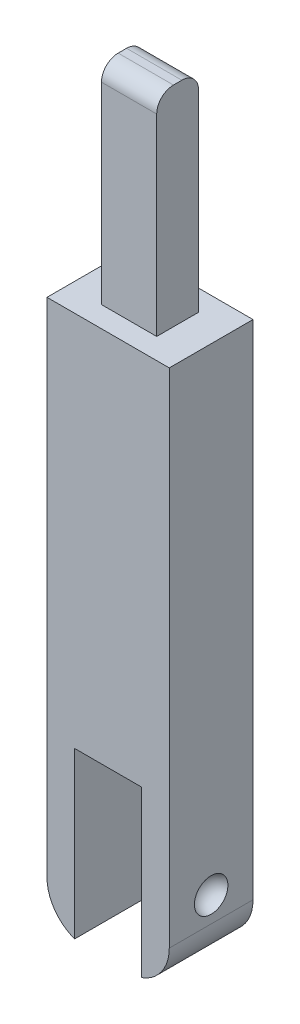
ISO-10303-21;
HEADER;
FILE_DESCRIPTION(('STEP AP214'),'2;1');
FILE_NAME('part.step','',(''),(''),'','','');
FILE_SCHEMA(('AUTOMOTIVE_DESIGN { 1 0 10303 214 1 1 1 1 }'));
ENDSEC;
DATA;
#1=APPLICATION_CONTEXT('core data for automotive mechanical design processes');
#2=APPLICATION_PROTOCOL_DEFINITION('international standard','automotive_design',2000,#1);
#3=PRODUCT_CONTEXT('',#1,'mechanical');
#4=PRODUCT('Part','Part','',(#3));
#5=PRODUCT_RELATED_PRODUCT_CATEGORY('part','',(#4));
#6=PRODUCT_DEFINITION_FORMATION('','',#4);
#7=PRODUCT_DEFINITION_CONTEXT('part definition',#1,'design');
#8=PRODUCT_DEFINITION('design','',#6,#7);
#9=PRODUCT_DEFINITION_SHAPE('','',#8);
#10=(LENGTH_UNIT() NAMED_UNIT(*) SI_UNIT(.MILLI.,.METRE.));
#11=(NAMED_UNIT(*) PLANE_ANGLE_UNIT() SI_UNIT($,.RADIAN.));
#12=(NAMED_UNIT(*) SI_UNIT($,.STERADIAN.) SOLID_ANGLE_UNIT());
#13=UNCERTAINTY_MEASURE_WITH_UNIT(LENGTH_MEASURE(1.E-05),#10,'distance_accuracy_value','');
#14=(GEOMETRIC_REPRESENTATION_CONTEXT(3) GLOBAL_UNCERTAINTY_ASSIGNED_CONTEXT((#13)) GLOBAL_UNIT_ASSIGNED_CONTEXT((#10,
#11,#12)) REPRESENTATION_CONTEXT('',''));
#15=CARTESIAN_POINT('',(0.,0.,0.));
#16=DIRECTION('',(0.,0.,1.));
#17=DIRECTION('',(1.,0.,0.));
#18=AXIS2_PLACEMENT_3D('',#15,#16,#17);
#19=CARTESIAN_POINT('',(-7.30000000000001,50.,5.));
#20=DIRECTION('',(1.,0.,0.));
#21=DIRECTION('',(0.,1.,0.));
#22=AXIS2_PLACEMENT_3D('',#19,#20,#21);
#23=PLANE('',#22);
#24=CARTESIAN_POINT('',(-7.30000000000001,-32.,0.));
#25=DIRECTION('',(-1.,0.,0.));
#26=DIRECTION('',(0.,0.,1.));
#27=AXIS2_PLACEMENT_3D('',#24,#25,#26);
#28=CIRCLE('',#27,2.);
#29=CARTESIAN_POINT('',(-7.30000000000001,-32.,2.));
#30=VERTEX_POINT('',#29);
#31=EDGE_CURVE('E201',#30,#30,#28,.T.);
#32=ORIENTED_EDGE('',*,*,#31,.F.);
#33=EDGE_LOOP('',(#32));
#34=FACE_BOUND('',#33,.T.);
#35=DIRECTION('',(0.,-1.,0.));
#36=VECTOR('',#35,1.);
#37=CARTESIAN_POINT('',(-7.30000000000001,50.,5.));
#38=LINE('',#37,#36);
#39=CARTESIAN_POINT('',(-7.3,25.,5.));
#40=VERTEX_POINT('',#39);
#41=CARTESIAN_POINT('',(-7.3,-35.,5.));
#42=VERTEX_POINT('',#41);
#43=EDGE_CURVE('E207',#40,#42,#38,.T.);
#44=ORIENTED_EDGE('',*,*,#43,.F.);
#45=DIRECTION('',(0.,0.,1.));
#46=VECTOR('',#45,1.);
#47=CARTESIAN_POINT('',(-7.3,25.,-5.));
#48=LINE('',#47,#46);
#49=CARTESIAN_POINT('',(-7.3,25.,-5.));
#50=VERTEX_POINT('',#49);
#51=EDGE_CURVE('E186',#50,#40,#48,.T.);
#52=ORIENTED_EDGE('',*,*,#51,.F.);
#53=DIRECTION('',(0.,-1.,0.));
#54=VECTOR('',#53,1.);
#55=CARTESIAN_POINT('',(-7.30000000000001,50.,-5.));
#56=LINE('',#55,#54);
#57=CARTESIAN_POINT('',(-7.3,-35.,-5.));
#58=VERTEX_POINT('',#57);
#59=EDGE_CURVE('E204',#50,#58,#56,.T.);
#60=ORIENTED_EDGE('',*,*,#59,.T.);
#61=DIRECTION('',(0.,0.,-1.));
#62=VECTOR('',#61,1.);
#63=CARTESIAN_POINT('',(-7.3,-35.,5.));
#64=LINE('',#63,#62);
#65=EDGE_CURVE('E222',#58,#42,#64,.F.);
#66=ORIENTED_EDGE('',*,*,#65,.T.);
#67=EDGE_LOOP('',(#44,#52,#60,#66));
#68=FACE_BOUND('',#67,.T.);
#69=ADVANCED_FACE('F36',(#34,#68),#23,.F.);
#70=CARTESIAN_POINT('',(7.29999999999999,50.,5.));
#71=DIRECTION('',(-1.,0.,0.));
#72=DIRECTION('',(0.,-1.,0.));
#73=AXIS2_PLACEMENT_3D('',#70,#71,#72);
#74=PLANE('',#73);
#75=CARTESIAN_POINT('',(7.3,-32.,0.));
#76=DIRECTION('',(-1.,0.,0.));
#77=DIRECTION('',(0.,0.,1.));
#78=AXIS2_PLACEMENT_3D('',#75,#76,#77);
#79=CIRCLE('',#78,2.);
#80=CARTESIAN_POINT('',(7.3,-32.,2.));
#81=VERTEX_POINT('',#80);
#82=EDGE_CURVE('E188',#81,#81,#79,.T.);
#83=ORIENTED_EDGE('',*,*,#82,.T.);
#84=EDGE_LOOP('',(#83));
#85=FACE_BOUND('',#84,.T.);
#86=DIRECTION('',(0.,1.,0.));
#87=VECTOR('',#86,1.);
#88=CARTESIAN_POINT('',(7.29999999999999,50.,-5.));
#89=LINE('',#88,#87);
#90=CARTESIAN_POINT('',(7.3,-35.,-5.));
#91=VERTEX_POINT('',#90);
#92=CARTESIAN_POINT('',(7.3,25.,-5.));
#93=VERTEX_POINT('',#92);
#94=EDGE_CURVE('E210',#91,#93,#89,.T.);
#95=ORIENTED_EDGE('',*,*,#94,.T.);
#96=DIRECTION('',(0.,0.,1.));
#97=VECTOR('',#96,1.);
#98=CARTESIAN_POINT('',(7.3,25.,-5.));
#99=LINE('',#98,#97);
#100=CARTESIAN_POINT('',(7.3,25.,5.));
#101=VERTEX_POINT('',#100);
#102=EDGE_CURVE('E196',#93,#101,#99,.T.);
#103=ORIENTED_EDGE('',*,*,#102,.T.);
#104=DIRECTION('',(0.,1.,0.));
#105=VECTOR('',#104,1.);
#106=CARTESIAN_POINT('',(7.29999999999999,50.,5.));
#107=LINE('',#106,#105);
#108=CARTESIAN_POINT('',(7.3,-35.,5.));
#109=VERTEX_POINT('',#108);
#110=EDGE_CURVE('E209',#109,#101,#107,.T.);
#111=ORIENTED_EDGE('',*,*,#110,.F.);
#112=DIRECTION('',(0.,0.,-1.));
#113=VECTOR('',#112,1.);
#114=CARTESIAN_POINT('',(7.3,-35.,5.));
#115=LINE('',#114,#113);
#116=EDGE_CURVE('E228',#109,#91,#115,.T.);
#117=ORIENTED_EDGE('',*,*,#116,.T.);
#118=EDGE_LOOP('',(#95,#103,#111,#117));
#119=FACE_BOUND('',#118,.T.);
#120=ADVANCED_FACE('F259',(#85,#119),#74,.F.);
#121=CARTESIAN_POINT('',(-7.30000000000001,50.,5.));
#122=DIRECTION('',(0.,-1.,0.));
#123=DIRECTION('',(0.,0.,-1.));
#124=AXIS2_PLACEMENT_3D('',#121,#122,#123);
#125=PLANE('',#124);
#126=DIRECTION('',(0.,0.,1.));
#127=VECTOR('',#126,1.);
#128=CARTESIAN_POINT('',(3.29999999999999,50.,-5.));
#129=LINE('',#128,#127);
#130=CARTESIAN_POINT('',(3.29999999999999,50.,-0.5));
#131=VERTEX_POINT('',#130);
#132=CARTESIAN_POINT('',(3.29999999999999,50.,0.5));
#133=VERTEX_POINT('',#132);
#134=EDGE_CURVE('E185',#131,#133,#129,.T.);
#135=ORIENTED_EDGE('',*,*,#134,.F.);
#136=DIRECTION('',(1.,0.,0.));
#137=VECTOR('',#136,1.);
#138=CARTESIAN_POINT('',(-7.30000000000001,50.,-0.5));
#139=LINE('',#138,#137);
#140=CARTESIAN_POINT('',(-3.30000000000001,50.,-0.5));
#141=VERTEX_POINT('',#140);
#142=EDGE_CURVE('E245',#131,#141,#139,.F.);
#143=ORIENTED_EDGE('',*,*,#142,.T.);
#144=DIRECTION('',(0.,0.,1.));
#145=VECTOR('',#144,1.);
#146=CARTESIAN_POINT('',(-3.30000000000001,50.,-5.));
#147=LINE('',#146,#145);
#148=CARTESIAN_POINT('',(-3.30000000000001,50.,0.5));
#149=VERTEX_POINT('',#148);
#150=EDGE_CURVE('E189',#141,#149,#147,.T.);
#151=ORIENTED_EDGE('',*,*,#150,.T.);
#152=DIRECTION('',(1.,0.,0.));
#153=VECTOR('',#152,1.);
#154=CARTESIAN_POINT('',(-7.30000000000001,50.,0.5));
#155=LINE('',#154,#153);
#156=EDGE_CURVE('E242',#149,#133,#155,.T.);
#157=ORIENTED_EDGE('',*,*,#156,.T.);
#158=EDGE_LOOP('',(#135,#143,#151,#157));
#159=FACE_BOUND('',#158,.T.);
#160=ADVANCED_FACE('F289',(#159),#125,.F.);
#161=CARTESIAN_POINT('',(0.,0.,5.));
#162=DIRECTION('',(0.,0.,1.));
#163=DIRECTION('',(1.,0.,0.));
#164=AXIS2_PLACEMENT_3D('',#161,#162,#163);
#165=PLANE('',#164);
#166=DIRECTION('',(0.,-1.,0.));
#167=VECTOR('',#166,1.);
#168=CARTESIAN_POINT('',(4.,-20.,5.));
#169=LINE('',#168,#167);
#170=CARTESIAN_POINT('',(4.,-20.,5.));
#171=VERTEX_POINT('',#170);
#172=CARTESIAN_POINT('',(3.99999999999999,-39.7021271782035,5.));
#173=VERTEX_POINT('',#172);
#174=EDGE_CURVE('E161',#171,#173,#169,.T.);
#175=ORIENTED_EDGE('',*,*,#174,.T.);
#176=CARTESIAN_POINT('',(2.3,-35.,5.));
#177=DIRECTION('',(0.,0.,1.));
#178=DIRECTION('',(1.,0.,0.));
#179=AXIS2_PLACEMENT_3D('',#176,#177,#178);
#180=CIRCLE('',#179,5.);
#181=EDGE_CURVE('E225',#173,#109,#180,.T.);
#182=ORIENTED_EDGE('',*,*,#181,.T.);
#183=ORIENTED_EDGE('',*,*,#110,.T.);
#184=DIRECTION('',(1.,0.,0.));
#185=VECTOR('',#184,1.);
#186=CARTESIAN_POINT('',(0.,25.,5.));
#187=LINE('',#186,#185);
#188=EDGE_CURVE('E183',#40,#101,#187,.T.);
#189=ORIENTED_EDGE('',*,*,#188,.F.);
#190=ORIENTED_EDGE('',*,*,#43,.T.);
#191=CARTESIAN_POINT('',(-2.3,-35.,5.));
#192=DIRECTION('',(0.,0.,1.));
#193=DIRECTION('',(1.,0.,0.));
#194=AXIS2_PLACEMENT_3D('',#191,#192,#193);
#195=CIRCLE('',#194,5.);
#196=CARTESIAN_POINT('',(-4.00000000000001,-39.7021271782035,5.));
#197=VERTEX_POINT('',#196);
#198=EDGE_CURVE('E160',#42,#197,#195,.T.);
#199=ORIENTED_EDGE('',*,*,#198,.T.);
#200=DIRECTION('',(0.,1.,0.));
#201=VECTOR('',#200,1.);
#202=CARTESIAN_POINT('',(-4.,-20.,5.));
#203=LINE('',#202,#201);
#204=CARTESIAN_POINT('',(-4.,-20.,5.));
#205=VERTEX_POINT('',#204);
#206=EDGE_CURVE('E141',#197,#205,#203,.T.);
#207=ORIENTED_EDGE('',*,*,#206,.T.);
#208=DIRECTION('',(1.,0.,0.));
#209=VECTOR('',#208,1.);
#210=CARTESIAN_POINT('',(4.,-20.,5.));
#211=LINE('',#210,#209);
#212=EDGE_CURVE('E149',#205,#171,#211,.T.);
#213=ORIENTED_EDGE('',*,*,#212,.T.);
#214=EDGE_LOOP('',(#175,#182,#183,#189,#190,#199,#207,#213));
#215=FACE_BOUND('',#214,.T.);
#216=ADVANCED_FACE('F158',(#215),#165,.T.);
#217=CARTESIAN_POINT('',(0.,0.,-5.));
#218=DIRECTION('',(0.,0.,1.));
#219=DIRECTION('',(1.,0.,0.));
#220=AXIS2_PLACEMENT_3D('',#217,#218,#219);
#221=PLANE('',#220);
#222=CARTESIAN_POINT('',(2.3,-35.,-5.));
#223=DIRECTION('',(0.,0.,1.));
#224=DIRECTION('',(1.,0.,0.));
#225=AXIS2_PLACEMENT_3D('',#222,#223,#224);
#226=CIRCLE('',#225,5.);
#227=CARTESIAN_POINT('',(4.,-39.7021271782035,-5.));
#228=VERTEX_POINT('',#227);
#229=EDGE_CURVE('E213',#91,#228,#226,.F.);
#230=ORIENTED_EDGE('',*,*,#229,.T.);
#231=DIRECTION('',(0.,-1.,0.));
#232=VECTOR('',#231,1.);
#233=CARTESIAN_POINT('',(4.,-20.,-5.));
#234=LINE('',#233,#232);
#235=CARTESIAN_POINT('',(4.,-20.,-5.));
#236=VERTEX_POINT('',#235);
#237=EDGE_CURVE('E51',#236,#228,#234,.T.);
#238=ORIENTED_EDGE('',*,*,#237,.F.);
#239=DIRECTION('',(1.,0.,0.));
#240=VECTOR('',#239,1.);
#241=CARTESIAN_POINT('',(4.,-20.,-5.));
#242=LINE('',#241,#240);
#243=CARTESIAN_POINT('',(-4.,-20.,-5.));
#244=VERTEX_POINT('',#243);
#245=EDGE_CURVE('E163',#244,#236,#242,.T.);
#246=ORIENTED_EDGE('',*,*,#245,.F.);
#247=DIRECTION('',(0.,1.,0.));
#248=VECTOR('',#247,1.);
#249=CARTESIAN_POINT('',(-4.,-20.,-5.));
#250=LINE('',#249,#248);
#251=CARTESIAN_POINT('',(-4.00000000000001,-39.7021271782035,-5.));
#252=VERTEX_POINT('',#251);
#253=EDGE_CURVE('E144',#252,#244,#250,.T.);
#254=ORIENTED_EDGE('',*,*,#253,.F.);
#255=CARTESIAN_POINT('',(-2.3,-35.,-5.));
#256=DIRECTION('',(0.,0.,1.));
#257=DIRECTION('',(1.,0.,0.));
#258=AXIS2_PLACEMENT_3D('',#255,#256,#257);
#259=CIRCLE('',#258,5.);
#260=EDGE_CURVE('E220',#252,#58,#259,.F.);
#261=ORIENTED_EDGE('',*,*,#260,.T.);
#262=ORIENTED_EDGE('',*,*,#59,.F.);
#263=DIRECTION('',(1.,0.,0.));
#264=VECTOR('',#263,1.);
#265=CARTESIAN_POINT('',(0.,25.,-5.));
#266=LINE('',#265,#264);
#267=EDGE_CURVE('E180',#50,#93,#266,.T.);
#268=ORIENTED_EDGE('',*,*,#267,.T.);
#269=ORIENTED_EDGE('',*,*,#94,.F.);
#270=EDGE_LOOP('',(#230,#238,#246,#254,#261,#262,#268,#269));
#271=FACE_BOUND('',#270,.T.);
#272=ADVANCED_FACE('F261',(#271),#221,.F.);
#273=CARTESIAN_POINT('',(-2.3,-35.,5.));
#274=DIRECTION('',(0.,0.,-1.));
#275=DIRECTION('',(-1.,0.,0.));
#276=AXIS2_PLACEMENT_3D('',#273,#274,#275);
#277=CYLINDRICAL_SURFACE('',#276,5.);
#278=DIRECTION('',(0.,0.,-1.));
#279=VECTOR('',#278,1.);
#280=CARTESIAN_POINT('',(-4.00000000000001,-39.7021271782035,5.));
#281=LINE('',#280,#279);
#282=EDGE_CURVE('E11',#197,#252,#281,.T.);
#283=ORIENTED_EDGE('',*,*,#282,.F.);
#284=ORIENTED_EDGE('',*,*,#198,.F.);
#285=ORIENTED_EDGE('',*,*,#65,.F.);
#286=ORIENTED_EDGE('',*,*,#260,.F.);
#287=EDGE_LOOP('',(#283,#284,#285,#286));
#288=FACE_BOUND('',#287,.T.);
#289=ADVANCED_FACE('F273',(#288),#277,.T.);
#290=CARTESIAN_POINT('',(2.3,-35.,5.));
#291=DIRECTION('',(0.,0.,-1.));
#292=DIRECTION('',(-1.,0.,0.));
#293=AXIS2_PLACEMENT_3D('',#290,#291,#292);
#294=CYLINDRICAL_SURFACE('',#293,5.);
#295=DIRECTION('',(0.,0.,-1.));
#296=VECTOR('',#295,1.);
#297=CARTESIAN_POINT('',(3.99999999999999,-39.7021271782035,5.));
#298=LINE('',#297,#296);
#299=EDGE_CURVE('E44',#228,#173,#298,.F.);
#300=ORIENTED_EDGE('',*,*,#299,.F.);
#301=ORIENTED_EDGE('',*,*,#229,.F.);
#302=ORIENTED_EDGE('',*,*,#116,.F.);
#303=ORIENTED_EDGE('',*,*,#181,.F.);
#304=EDGE_LOOP('',(#300,#301,#302,#303));
#305=FACE_BOUND('',#304,.T.);
#306=ADVANCED_FACE('F256',(#305),#294,.T.);
#307=CARTESIAN_POINT('',(7.3,-32.,0.));
#308=DIRECTION('',(-1.,0.,0.));
#309=DIRECTION('',(0.,1.,0.));
#310=AXIS2_PLACEMENT_3D('',#307,#308,#309);
#311=SPHERICAL_SURFACE('',#310,2.);
#312=ORIENTED_EDGE('',*,*,#82,.F.);
#313=EDGE_LOOP('',(#312));
#314=FACE_BOUND('',#313,.T.);
#315=ADVANCED_FACE('F280',(#314),#311,.F.);
#316=CARTESIAN_POINT('',(-7.30000000000001,-32.,0.));
#317=DIRECTION('',(-1.,0.,0.));
#318=DIRECTION('',(0.,1.,0.));
#319=AXIS2_PLACEMENT_3D('',#316,#317,#318);
#320=SPHERICAL_SURFACE('',#319,2.);
#321=ORIENTED_EDGE('',*,*,#31,.T.);
#322=EDGE_LOOP('',(#321));
#323=FACE_BOUND('',#322,.T.);
#324=ADVANCED_FACE('F301',(#323),#320,.F.);
#325=CARTESIAN_POINT('',(3.3,0.,-5.));
#326=DIRECTION('',(-1.,0.,0.));
#327=DIRECTION('',(0.,-1.,0.));
#328=AXIS2_PLACEMENT_3D('',#325,#326,#327);
#329=PLANE('',#328);
#330=DIRECTION('',(0.,-1.,0.));
#331=VECTOR('',#330,1.);
#332=CARTESIAN_POINT('',(3.3,25.,-2.5));
#333=LINE('',#332,#331);
#334=CARTESIAN_POINT('',(3.29999999999999,48.,-2.5));
#335=VERTEX_POINT('',#334);
#336=CARTESIAN_POINT('',(3.3,25.,-2.5));
#337=VERTEX_POINT('',#336);
#338=EDGE_CURVE('E174',#335,#337,#333,.T.);
#339=ORIENTED_EDGE('',*,*,#338,.F.);
#340=CARTESIAN_POINT('',(3.3,48.,-0.5));
#341=DIRECTION('',(-1.,0.,0.));
#342=DIRECTION('',(0.,-1.,0.));
#343=AXIS2_PLACEMENT_3D('',#340,#341,#342);
#344=CIRCLE('',#343,2.);
#345=EDGE_CURVE('E240',#335,#131,#344,.F.);
#346=ORIENTED_EDGE('',*,*,#345,.T.);
#347=ORIENTED_EDGE('',*,*,#134,.T.);
#348=CARTESIAN_POINT('',(3.29999999999999,48.,0.5));
#349=DIRECTION('',(-1.,0.,0.));
#350=DIRECTION('',(0.,-1.,0.));
#351=AXIS2_PLACEMENT_3D('',#348,#349,#350);
#352=CIRCLE('',#351,2.);
#353=CARTESIAN_POINT('',(3.29999999999999,48.,2.5));
#354=VERTEX_POINT('',#353);
#355=EDGE_CURVE('E238',#133,#354,#352,.F.);
#356=ORIENTED_EDGE('',*,*,#355,.T.);
#357=DIRECTION('',(0.,1.,0.));
#358=VECTOR('',#357,1.);
#359=CARTESIAN_POINT('',(3.3,25.,2.5));
#360=LINE('',#359,#358);
#361=CARTESIAN_POINT('',(3.3,25.,2.5));
#362=VERTEX_POINT('',#361);
#363=EDGE_CURVE('E171',#362,#354,#360,.T.);
#364=ORIENTED_EDGE('',*,*,#363,.F.);
#365=DIRECTION('',(0.,0.,1.));
#366=VECTOR('',#365,1.);
#367=CARTESIAN_POINT('',(3.3,25.,-5.));
#368=LINE('',#367,#366);
#369=EDGE_CURVE('E176',#337,#362,#368,.T.);
#370=ORIENTED_EDGE('',*,*,#369,.F.);
#371=EDGE_LOOP('',(#339,#346,#347,#356,#364,#370));
#372=FACE_BOUND('',#371,.T.);
#373=ADVANCED_FACE('F305',(#372),#329,.F.);
#374=CARTESIAN_POINT('',(0.,25.,-5.));
#375=DIRECTION('',(0.,-1.,0.));
#376=DIRECTION('',(0.,0.,-1.));
#377=AXIS2_PLACEMENT_3D('',#374,#375,#376);
#378=PLANE('',#377);
#379=ORIENTED_EDGE('',*,*,#369,.T.);
#380=DIRECTION('',(1.,0.,0.));
#381=VECTOR('',#380,1.);
#382=CARTESIAN_POINT('',(-7.30000000000002,25.,2.5));
#383=LINE('',#382,#381);
#384=CARTESIAN_POINT('',(-3.30000000000001,25.,2.5));
#385=VERTEX_POINT('',#384);
#386=EDGE_CURVE('E173',#385,#362,#383,.T.);
#387=ORIENTED_EDGE('',*,*,#386,.F.);
#388=DIRECTION('',(0.,0.,1.));
#389=VECTOR('',#388,1.);
#390=CARTESIAN_POINT('',(-3.30000000000001,25.,-5.));
#391=LINE('',#390,#389);
#392=CARTESIAN_POINT('',(-3.30000000000001,25.,-2.5));
#393=VERTEX_POINT('',#392);
#394=EDGE_CURVE('E182',#393,#385,#391,.T.);
#395=ORIENTED_EDGE('',*,*,#394,.F.);
#396=DIRECTION('',(1.,0.,0.));
#397=VECTOR('',#396,1.);
#398=CARTESIAN_POINT('',(-7.30000000000002,25.,-2.5));
#399=LINE('',#398,#397);
#400=EDGE_CURVE('E169',#393,#337,#399,.T.);
#401=ORIENTED_EDGE('',*,*,#400,.T.);
#402=EDGE_LOOP('',(#379,#387,#395,#401));
#403=FACE_BOUND('',#402,.T.);
#404=ORIENTED_EDGE('',*,*,#51,.T.);
#405=ORIENTED_EDGE('',*,*,#188,.T.);
#406=ORIENTED_EDGE('',*,*,#102,.F.);
#407=ORIENTED_EDGE('',*,*,#267,.F.);
#408=EDGE_LOOP('',(#404,#405,#406,#407));
#409=FACE_BOUND('',#408,.T.);
#410=ADVANCED_FACE('F266',(#403,#409),#378,.F.);
#411=CARTESIAN_POINT('',(-3.30000000000001,0.,-5.));
#412=DIRECTION('',(1.,0.,0.));
#413=DIRECTION('',(0.,0.,-1.));
#414=AXIS2_PLACEMENT_3D('',#411,#412,#413);
#415=PLANE('',#414);
#416=ORIENTED_EDGE('',*,*,#150,.F.);
#417=CARTESIAN_POINT('',(-3.30000000000001,48.,-0.5));
#418=DIRECTION('',(1.,0.,0.));
#419=DIRECTION('',(0.,0.,-1.));
#420=AXIS2_PLACEMENT_3D('',#417,#418,#419);
#421=CIRCLE('',#420,2.);
#422=CARTESIAN_POINT('',(-3.30000000000001,48.,-2.5));
#423=VERTEX_POINT('',#422);
#424=EDGE_CURVE('E249',#141,#423,#421,.F.);
#425=ORIENTED_EDGE('',*,*,#424,.T.);
#426=DIRECTION('',(0.,-1.,0.));
#427=VECTOR('',#426,1.);
#428=CARTESIAN_POINT('',(-3.30000000000001,0.,-2.5));
#429=LINE('',#428,#427);
#430=EDGE_CURVE('E231',#423,#393,#429,.T.);
#431=ORIENTED_EDGE('',*,*,#430,.T.);
#432=ORIENTED_EDGE('',*,*,#394,.T.);
#433=DIRECTION('',(0.,1.,0.));
#434=VECTOR('',#433,1.);
#435=CARTESIAN_POINT('',(-3.30000000000001,0.,2.5));
#436=LINE('',#435,#434);
#437=CARTESIAN_POINT('',(-3.30000000000001,48.,2.5));
#438=VERTEX_POINT('',#437);
#439=EDGE_CURVE('E233',#385,#438,#436,.T.);
#440=ORIENTED_EDGE('',*,*,#439,.T.);
#441=CARTESIAN_POINT('',(-3.30000000000001,48.,0.5));
#442=DIRECTION('',(1.,0.,0.));
#443=DIRECTION('',(0.,0.,-1.));
#444=AXIS2_PLACEMENT_3D('',#441,#442,#443);
#445=CIRCLE('',#444,2.);
#446=EDGE_CURVE('E247',#438,#149,#445,.F.);
#447=ORIENTED_EDGE('',*,*,#446,.T.);
#448=EDGE_LOOP('',(#416,#425,#431,#432,#440,#447));
#449=FACE_BOUND('',#448,.T.);
#450=ADVANCED_FACE('F312',(#449),#415,.F.);
#451=CARTESIAN_POINT('',(-7.30000000000002,25.,-2.5));
#452=DIRECTION('',(0.,0.,1.));
#453=DIRECTION('',(1.,0.,0.));
#454=AXIS2_PLACEMENT_3D('',#451,#452,#453);
#455=PLANE('',#454);
#456=ORIENTED_EDGE('',*,*,#430,.F.);
#457=DIRECTION('',(1.,0.,0.));
#458=VECTOR('',#457,1.);
#459=CARTESIAN_POINT('',(-7.30000000000002,48.,-2.5));
#460=LINE('',#459,#458);
#461=EDGE_CURVE('E235',#423,#335,#460,.T.);
#462=ORIENTED_EDGE('',*,*,#461,.T.);
#463=ORIENTED_EDGE('',*,*,#338,.T.);
#464=ORIENTED_EDGE('',*,*,#400,.F.);
#465=EDGE_LOOP('',(#456,#462,#463,#464));
#466=FACE_BOUND('',#465,.T.);
#467=ADVANCED_FACE('F316',(#466),#455,.F.);
#468=CARTESIAN_POINT('',(-7.30000000000002,25.,2.5));
#469=DIRECTION('',(0.,0.,-1.));
#470=DIRECTION('',(-1.,0.,0.));
#471=AXIS2_PLACEMENT_3D('',#468,#469,#470);
#472=PLANE('',#471);
#473=ORIENTED_EDGE('',*,*,#363,.T.);
#474=DIRECTION('',(1.,0.,0.));
#475=VECTOR('',#474,1.);
#476=CARTESIAN_POINT('',(-7.30000000000002,48.,2.5));
#477=LINE('',#476,#475);
#478=EDGE_CURVE('E59',#354,#438,#477,.F.);
#479=ORIENTED_EDGE('',*,*,#478,.T.);
#480=ORIENTED_EDGE('',*,*,#439,.F.);
#481=ORIENTED_EDGE('',*,*,#386,.T.);
#482=EDGE_LOOP('',(#473,#479,#480,#481));
#483=FACE_BOUND('',#482,.T.);
#484=ADVANCED_FACE('F320',(#483),#472,.F.);
#485=CARTESIAN_POINT('',(-7.30000000000002,48.,-0.5));
#486=DIRECTION('',(1.,0.,0.));
#487=DIRECTION('',(0.,0.,-1.));
#488=AXIS2_PLACEMENT_3D('',#485,#486,#487);
#489=CYLINDRICAL_SURFACE('',#488,2.);
#490=ORIENTED_EDGE('',*,*,#424,.F.);
#491=ORIENTED_EDGE('',*,*,#142,.F.);
#492=ORIENTED_EDGE('',*,*,#345,.F.);
#493=ORIENTED_EDGE('',*,*,#461,.F.);
#494=EDGE_LOOP('',(#490,#491,#492,#493));
#495=FACE_BOUND('',#494,.T.);
#496=ADVANCED_FACE('F324',(#495),#489,.T.);
#497=CARTESIAN_POINT('',(-7.30000000000001,48.,0.5));
#498=DIRECTION('',(1.,0.,0.));
#499=DIRECTION('',(0.,0.,-1.));
#500=AXIS2_PLACEMENT_3D('',#497,#498,#499);
#501=CYLINDRICAL_SURFACE('',#500,2.);
#502=ORIENTED_EDGE('',*,*,#446,.F.);
#503=ORIENTED_EDGE('',*,*,#478,.F.);
#504=ORIENTED_EDGE('',*,*,#355,.F.);
#505=ORIENTED_EDGE('',*,*,#156,.F.);
#506=EDGE_LOOP('',(#502,#503,#504,#505));
#507=FACE_BOUND('',#506,.T.);
#508=ADVANCED_FACE('F38',(#507),#501,.T.);
#509=CARTESIAN_POINT('',(4.,-20.,5.));
#510=DIRECTION('',(1.,0.,0.));
#511=DIRECTION('',(0.,1.,0.));
#512=AXIS2_PLACEMENT_3D('',#509,#510,#511);
#513=PLANE('',#512);
#514=ORIENTED_EDGE('',*,*,#299,.T.);
#515=ORIENTED_EDGE('',*,*,#174,.F.);
#516=DIRECTION('',(0.,0.,-1.));
#517=VECTOR('',#516,1.);
#518=CARTESIAN_POINT('',(4.,-20.,5.));
#519=LINE('',#518,#517);
#520=EDGE_CURVE('E148',#171,#236,#519,.T.);
#521=ORIENTED_EDGE('',*,*,#520,.T.);
#522=ORIENTED_EDGE('',*,*,#237,.T.);
#523=EDGE_LOOP('',(#514,#515,#521,#522));
#524=FACE_BOUND('',#523,.T.);
#525=ADVANCED_FACE('F251',(#524),#513,.F.);
#526=CARTESIAN_POINT('',(4.,-20.,5.));
#527=DIRECTION('',(0.,1.,0.));
#528=DIRECTION('',(0.,0.,1.));
#529=AXIS2_PLACEMENT_3D('',#526,#527,#528);
#530=PLANE('',#529);
#531=ORIENTED_EDGE('',*,*,#245,.T.);
#532=ORIENTED_EDGE('',*,*,#520,.F.);
#533=ORIENTED_EDGE('',*,*,#212,.F.);
#534=DIRECTION('',(0.,0.,-1.));
#535=VECTOR('',#534,1.);
#536=CARTESIAN_POINT('',(-4.,-20.,5.));
#537=LINE('',#536,#535);
#538=EDGE_CURVE('E137',#205,#244,#537,.T.);
#539=ORIENTED_EDGE('',*,*,#538,.T.);
#540=EDGE_LOOP('',(#531,#532,#533,#539));
#541=FACE_BOUND('',#540,.T.);
#542=ADVANCED_FACE('F152',(#541),#530,.F.);
#543=CARTESIAN_POINT('',(-4.,-20.,5.));
#544=DIRECTION('',(-1.,0.,0.));
#545=DIRECTION('',(0.,-1.,0.));
#546=AXIS2_PLACEMENT_3D('',#543,#544,#545);
#547=PLANE('',#546);
#548=ORIENTED_EDGE('',*,*,#282,.T.);
#549=ORIENTED_EDGE('',*,*,#253,.T.);
#550=ORIENTED_EDGE('',*,*,#538,.F.);
#551=ORIENTED_EDGE('',*,*,#206,.F.);
#552=EDGE_LOOP('',(#548,#549,#550,#551));
#553=FACE_BOUND('',#552,.T.);
#554=ADVANCED_FACE('F139',(#553),#547,.F.);
#555=CLOSED_SHELL('',(#69,#120,#160,#216,#272,#289,#306,#315,#324,#373,#410,#450,#467,#484,#496,
#508,#525,#542,#554));
#556=MANIFOLD_SOLID_BREP('B2',#555);
#557=ADVANCED_BREP_SHAPE_REPRESENTATION('',(#18,#556),#14);
#558=SHAPE_DEFINITION_REPRESENTATION(#9,#557);
ENDSEC;
END-ISO-10303-21;
